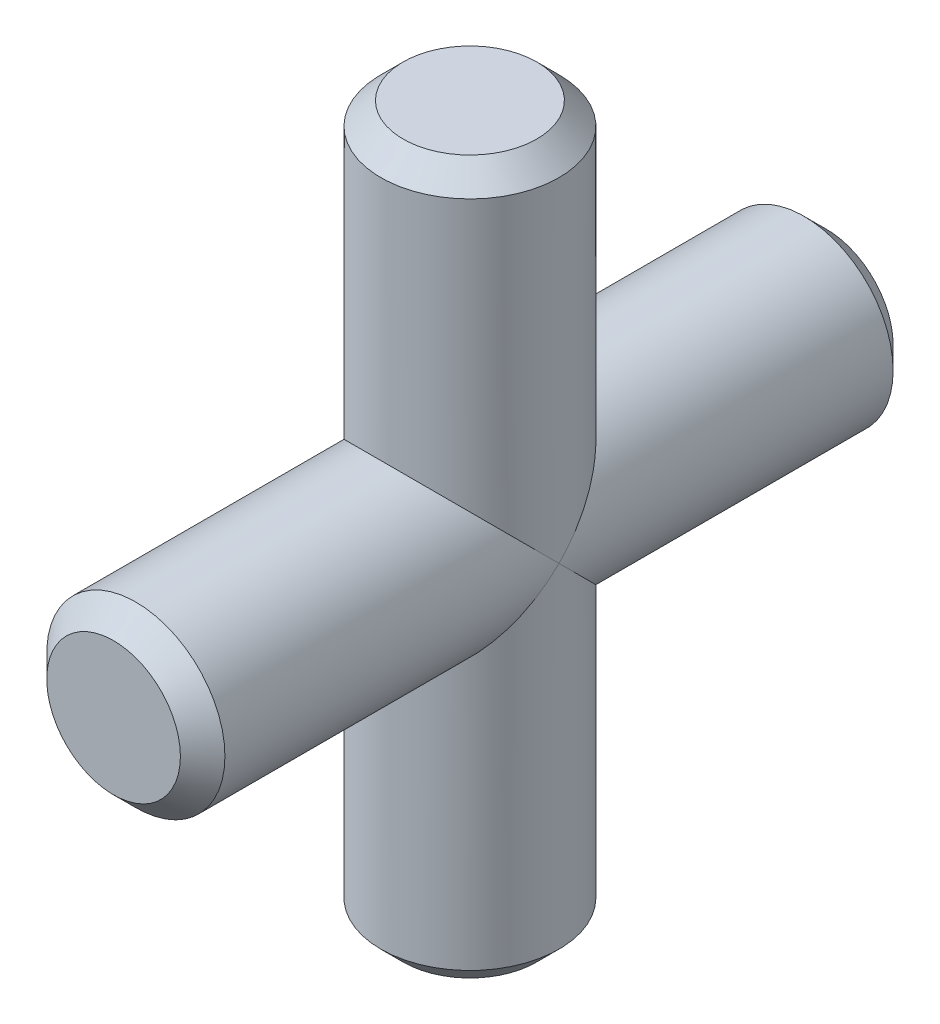
ISO-10303-21;
HEADER;
FILE_DESCRIPTION(('STEP AP214'),'2;1');
FILE_NAME('part.step','',(''),(''),'','','');
FILE_SCHEMA(('AUTOMOTIVE_DESIGN { 1 0 10303 214 1 1 1 1 }'));
ENDSEC;
DATA;
#1=APPLICATION_CONTEXT('core data for automotive mechanical design processes');
#2=APPLICATION_PROTOCOL_DEFINITION('international standard','automotive_design',2000,#1);
#3=PRODUCT_CONTEXT('',#1,'mechanical');
#4=PRODUCT('Part','Part','',(#3));
#5=PRODUCT_RELATED_PRODUCT_CATEGORY('part','',(#4));
#6=PRODUCT_DEFINITION_FORMATION('','',#4);
#7=PRODUCT_DEFINITION_CONTEXT('part definition',#1,'design');
#8=PRODUCT_DEFINITION('design','',#6,#7);
#9=PRODUCT_DEFINITION_SHAPE('','',#8);
#10=(LENGTH_UNIT() NAMED_UNIT(*) SI_UNIT(.MILLI.,.METRE.));
#11=(NAMED_UNIT(*) PLANE_ANGLE_UNIT() SI_UNIT($,.RADIAN.));
#12=(NAMED_UNIT(*) SI_UNIT($,.STERADIAN.) SOLID_ANGLE_UNIT());
#13=UNCERTAINTY_MEASURE_WITH_UNIT(LENGTH_MEASURE(1.E-05),#10,'distance_accuracy_value','');
#14=(GEOMETRIC_REPRESENTATION_CONTEXT(3) GLOBAL_UNCERTAINTY_ASSIGNED_CONTEXT((#13)) GLOBAL_UNIT_ASSIGNED_CONTEXT((#10,
#11,#12)) REPRESENTATION_CONTEXT('',''));
#15=CARTESIAN_POINT('',(0.,0.,0.));
#16=DIRECTION('',(0.,0.,1.));
#17=DIRECTION('',(1.,0.,0.));
#18=AXIS2_PLACEMENT_3D('',#15,#16,#17);
#19=CARTESIAN_POINT('',(0.,5.499989,0.));
#20=DIRECTION('',(0.,-1.,0.));
#21=DIRECTION('',(0.,0.,-1.));
#22=AXIS2_PLACEMENT_3D('',#19,#20,#21);
#23=CYLINDRICAL_SURFACE('',#22,1.37499725);
#24=CARTESIAN_POINT('',(0.,5.1562396875,0.));
#25=DIRECTION('',(0.,1.,0.));
#26=DIRECTION('',(0.,0.,1.));
#27=AXIS2_PLACEMENT_3D('',#24,#25,#26);
#28=CIRCLE('',#27,1.37499725);
#29=CARTESIAN_POINT('',(0.,5.1562396875,-1.37499725));
#30=VERTEX_POINT('',#29);
#31=EDGE_CURVE('E11',#30,#30,#28,.F.);
#32=ORIENTED_EDGE('',*,*,#31,.T.);
#33=EDGE_LOOP('',(#32));
#34=FACE_BOUND('',#33,.T.);
#35=CARTESIAN_POINT('',(0.,0.,0.));
#36=DIRECTION('',(0.,-0.707106781186547,-0.707106781186547));
#37=DIRECTION('',(0.,-0.707106781186547,0.707106781186547));
#38=AXIS2_PLACEMENT_3D('',#35,#36,#37);
#39=ELLIPSE('',#38,1.9445397591757,1.37499725);
#40=CARTESIAN_POINT('',(-1.37499725,0.,0.));
#41=VERTEX_POINT('',#40);
#42=CARTESIAN_POINT('',(1.37499725,0.,0.));
#43=VERTEX_POINT('',#42);
#44=EDGE_CURVE('E64',#41,#43,#39,.T.);
#45=ORIENTED_EDGE('',*,*,#44,.F.);
#46=CARTESIAN_POINT('',(0.,0.,0.));
#47=DIRECTION('',(0.,-0.707106781186547,0.707106781186547));
#48=DIRECTION('',(0.,-0.707106781186547,-0.707106781186547));
#49=AXIS2_PLACEMENT_3D('',#46,#47,#48);
#50=ELLIPSE('',#49,1.9445397591757,1.37499725);
#51=EDGE_CURVE('E63',#43,#41,#50,.T.);
#52=ORIENTED_EDGE('',*,*,#51,.F.);
#53=EDGE_LOOP('',(#45,#52));
#54=FACE_BOUND('',#53,.T.);
#55=ADVANCED_FACE('F43',(#34,#54),#23,.T.);
#56=CARTESIAN_POINT('',(0.,5.499989,0.));
#57=DIRECTION('',(0.,1.,0.));
#58=DIRECTION('',(0.,0.,1.));
#59=AXIS2_PLACEMENT_3D('',#56,#57,#58);
#60=PLANE('',#59);
#61=CARTESIAN_POINT('',(0.,5.499989,0.));
#62=DIRECTION('',(0.,1.,0.));
#63=DIRECTION('',(0.,0.,1.));
#64=AXIS2_PLACEMENT_3D('',#61,#62,#63);
#65=CIRCLE('',#64,1.0312479375);
#66=CARTESIAN_POINT('',(0.,5.499989,-1.0312479375));
#67=VERTEX_POINT('',#66);
#68=EDGE_CURVE('E51',#67,#67,#65,.T.);
#69=ORIENTED_EDGE('',*,*,#68,.T.);
#70=EDGE_LOOP('',(#69));
#71=FACE_BOUND('',#70,.T.);
#72=ADVANCED_FACE('F97',(#71),#60,.T.);
#73=CARTESIAN_POINT('',(0.,0.,-5.499989));
#74=DIRECTION('',(0.,0.,1.));
#75=DIRECTION('',(1.,0.,0.));
#76=AXIS2_PLACEMENT_3D('',#73,#74,#75);
#77=PLANE('',#76);
#78=CARTESIAN_POINT('',(0.,0.,-5.499989));
#79=DIRECTION('',(0.,0.,1.));
#80=DIRECTION('',(1.,0.,0.));
#81=AXIS2_PLACEMENT_3D('',#78,#79,#80);
#82=CIRCLE('',#81,1.03124793749999);
#83=CARTESIAN_POINT('',(1.03124793750001,0.,-5.499989));
#84=VERTEX_POINT('',#83);
#85=EDGE_CURVE('E78',#84,#84,#82,.F.);
#86=ORIENTED_EDGE('',*,*,#85,.T.);
#87=EDGE_LOOP('',(#86));
#88=FACE_BOUND('',#87,.T.);
#89=ADVANCED_FACE('F116',(#88),#77,.F.);
#90=CARTESIAN_POINT('',(0.,0.,5.499989));
#91=DIRECTION('',(0.,0.,-1.));
#92=DIRECTION('',(-1.,0.,0.));
#93=AXIS2_PLACEMENT_3D('',#90,#91,#92);
#94=CYLINDRICAL_SURFACE('',#93,1.37499724999999);
#95=CARTESIAN_POINT('',(0.,0.,-5.1562396875));
#96=DIRECTION('',(0.,0.,1.));
#97=DIRECTION('',(1.,0.,0.));
#98=AXIS2_PLACEMENT_3D('',#95,#96,#97);
#99=CIRCLE('',#98,1.37499724999999);
#100=CARTESIAN_POINT('',(1.37499725000002,0.,-5.1562396875));
#101=VERTEX_POINT('',#100);
#102=EDGE_CURVE('E75',#101,#101,#99,.T.);
#103=ORIENTED_EDGE('',*,*,#102,.T.);
#104=EDGE_LOOP('',(#103));
#105=FACE_BOUND('',#104,.T.);
#106=CARTESIAN_POINT('',(0.,0.,0.));
#107=DIRECTION('',(0.,-0.707106781186547,0.707106781186547));
#108=DIRECTION('',(0.,-0.707106781186547,-0.707106781186547));
#109=AXIS2_PLACEMENT_3D('',#106,#107,#108);
#110=ELLIPSE('',#109,1.9445397591757,1.37499725);
#111=EDGE_CURVE('E57',#43,#41,#110,.F.);
#112=ORIENTED_EDGE('',*,*,#111,.T.);
#113=ORIENTED_EDGE('',*,*,#44,.T.);
#114=EDGE_LOOP('',(#112,#113));
#115=FACE_BOUND('',#114,.T.);
#116=ADVANCED_FACE('F72',(#105,#115),#94,.T.);
#117=CARTESIAN_POINT('',(0.,-5.499989,0.));
#118=DIRECTION('',(0.,1.,0.));
#119=DIRECTION('',(0.,0.,1.));
#120=AXIS2_PLACEMENT_3D('',#117,#118,#119);
#121=PLANE('',#120);
#122=CARTESIAN_POINT('',(0.,-5.499989,0.));
#123=DIRECTION('',(0.,1.,0.));
#124=DIRECTION('',(0.,0.,1.));
#125=AXIS2_PLACEMENT_3D('',#122,#123,#124);
#126=CIRCLE('',#125,1.0312479375);
#127=CARTESIAN_POINT('',(0.,-5.499989,1.0312479375));
#128=VERTEX_POINT('',#127);
#129=EDGE_CURVE('E92',#128,#128,#126,.F.);
#130=ORIENTED_EDGE('',*,*,#129,.T.);
#131=EDGE_LOOP('',(#130));
#132=FACE_BOUND('',#131,.T.);
#133=ADVANCED_FACE('F121',(#132),#121,.F.);
#134=CARTESIAN_POINT('',(0.,-5.1562396875,0.));
#135=DIRECTION('',(0.,1.,0.));
#136=DIRECTION('',(0.,0.,1.));
#137=AXIS2_PLACEMENT_3D('',#134,#135,#136);
#138=CIRCLE('',#137,1.37499725);
#139=CARTESIAN_POINT('',(0.,-5.1562396875,1.37499725));
#140=VERTEX_POINT('',#139);
#141=EDGE_CURVE('E89',#140,#140,#138,.T.);
#142=ORIENTED_EDGE('',*,*,#141,.T.);
#143=EDGE_LOOP('',(#142));
#144=FACE_BOUND('',#143,.T.);
#145=CARTESIAN_POINT('',(0.,0.,0.));
#146=DIRECTION('',(0.,-0.707106781186547,-0.707106781186547));
#147=DIRECTION('',(0.,-0.707106781186547,0.707106781186547));
#148=AXIS2_PLACEMENT_3D('',#145,#146,#147);
#149=ELLIPSE('',#148,1.9445397591757,1.37499725);
#150=EDGE_CURVE('E70',#41,#43,#149,.F.);
#151=ORIENTED_EDGE('',*,*,#150,.F.);
#152=ORIENTED_EDGE('',*,*,#111,.F.);
#153=EDGE_LOOP('',(#151,#152));
#154=FACE_BOUND('',#153,.T.);
#155=ADVANCED_FACE('F69',(#144,#154),#23,.T.);
#156=CARTESIAN_POINT('',(0.,0.,5.1562396875));
#157=DIRECTION('',(0.,0.,1.));
#158=DIRECTION('',(1.,0.,0.));
#159=AXIS2_PLACEMENT_3D('',#156,#157,#158);
#160=CIRCLE('',#159,1.37499724999999);
#161=CARTESIAN_POINT('',(1.37499725000002,0.,5.1562396875));
#162=VERTEX_POINT('',#161);
#163=EDGE_CURVE('E86',#162,#162,#160,.F.);
#164=ORIENTED_EDGE('',*,*,#163,.T.);
#165=EDGE_LOOP('',(#164));
#166=FACE_BOUND('',#165,.T.);
#167=ORIENTED_EDGE('',*,*,#51,.T.);
#168=ORIENTED_EDGE('',*,*,#150,.T.);
#169=EDGE_LOOP('',(#167,#168));
#170=FACE_BOUND('',#169,.T.);
#171=ADVANCED_FACE('F74',(#166,#170),#94,.T.);
#172=CARTESIAN_POINT('',(0.,0.,5.499989));
#173=DIRECTION('',(0.,0.,1.));
#174=DIRECTION('',(1.,0.,0.));
#175=AXIS2_PLACEMENT_3D('',#172,#173,#174);
#176=PLANE('',#175);
#177=CARTESIAN_POINT('',(0.,0.,5.499989));
#178=DIRECTION('',(0.,0.,1.));
#179=DIRECTION('',(1.,0.,0.));
#180=AXIS2_PLACEMENT_3D('',#177,#178,#179);
#181=CIRCLE('',#180,1.03124793749999);
#182=CARTESIAN_POINT('',(1.03124793750002,0.,5.499989));
#183=VERTEX_POINT('',#182);
#184=EDGE_CURVE('E83',#183,#183,#181,.T.);
#185=ORIENTED_EDGE('',*,*,#184,.T.);
#186=EDGE_LOOP('',(#185));
#187=FACE_BOUND('',#186,.T.);
#188=ADVANCED_FACE('F128',(#187),#176,.T.);
#189=CARTESIAN_POINT('',(0.,0.,-5.1562396875));
#190=DIRECTION('',(0.,0.,1.));
#191=DIRECTION('',(1.,0.,0.));
#192=AXIS2_PLACEMENT_3D('',#189,#190,#191);
#193=CONICAL_SURFACE('',#192,1.37499724999999,0.785398163397453);
#194=ORIENTED_EDGE('',*,*,#85,.F.);
#195=EDGE_LOOP('',(#194));
#196=FACE_BOUND('',#195,.T.);
#197=ORIENTED_EDGE('',*,*,#102,.F.);
#198=EDGE_LOOP('',(#197));
#199=FACE_BOUND('',#198,.T.);
#200=ADVANCED_FACE('F144',(#196,#199),#193,.T.);
#201=CARTESIAN_POINT('',(0.,0.,5.499989));
#202=DIRECTION('',(0.,0.,-1.));
#203=DIRECTION('',(-1.,0.,0.));
#204=AXIS2_PLACEMENT_3D('',#201,#202,#203);
#205=CONICAL_SURFACE('',#204,1.03124793749999,0.785398163397449);
#206=ORIENTED_EDGE('',*,*,#163,.F.);
#207=EDGE_LOOP('',(#206));
#208=FACE_BOUND('',#207,.T.);
#209=ORIENTED_EDGE('',*,*,#184,.F.);
#210=EDGE_LOOP('',(#209));
#211=FACE_BOUND('',#210,.T.);
#212=ADVANCED_FACE('F106',(#208,#211),#205,.T.);
#213=CARTESIAN_POINT('',(0.,-5.1562396875,0.));
#214=DIRECTION('',(0.,1.,0.));
#215=DIRECTION('',(0.,0.,1.));
#216=AXIS2_PLACEMENT_3D('',#213,#214,#215);
#217=CONICAL_SURFACE('',#216,1.37499725,0.785398163397453);
#218=ORIENTED_EDGE('',*,*,#129,.F.);
#219=EDGE_LOOP('',(#218));
#220=FACE_BOUND('',#219,.T.);
#221=ORIENTED_EDGE('',*,*,#141,.F.);
#222=EDGE_LOOP('',(#221));
#223=FACE_BOUND('',#222,.T.);
#224=ADVANCED_FACE('F100',(#220,#223),#217,.T.);
#225=CARTESIAN_POINT('',(0.,5.499989,0.));
#226=DIRECTION('',(0.,-1.,0.));
#227=DIRECTION('',(0.,0.,-1.));
#228=AXIS2_PLACEMENT_3D('',#225,#226,#227);
#229=CONICAL_SURFACE('',#228,1.0312479375,0.785398163397446);
#230=CARTESIAN_POINT('',(0.,5.1562396875,-1.37499725));
#231=CARTESIAN_POINT('',(0.,5.15982040950521,-1.37141652799479));
#232=CARTESIAN_POINT('',(0.,5.16340113151042,-1.36783580598958));
#233=CARTESIAN_POINT('',(0.,5.17056257552083,-1.36067436197917));
#234=CARTESIAN_POINT('',(0.,5.17414329752604,-1.35709363997396));
#235=CARTESIAN_POINT('',(0.,5.18130474153646,-1.34993219596354));
#236=CARTESIAN_POINT('',(0.,5.18488546354166,-1.34635147395833));
#237=CARTESIAN_POINT('',(0.,5.19204690755208,-1.33919002994792));
#238=CARTESIAN_POINT('',(0.,5.19562762955729,-1.33560930794271));
#239=CARTESIAN_POINT('',(0.,5.20278907356771,-1.32844786393229));
#240=CARTESIAN_POINT('',(0.,5.20636979557291,-1.32486714192708));
#241=CARTESIAN_POINT('',(0.,5.21353123958333,-1.31770569791667));
#242=CARTESIAN_POINT('',(0.,5.21711196158854,-1.31412497591146));
#243=CARTESIAN_POINT('',(0.,5.22427340559896,-1.30696353190104));
#244=CARTESIAN_POINT('',(0.,5.22785412760416,-1.30338280989583));
#245=CARTESIAN_POINT('',(0.,5.23501557161458,-1.29622136588542));
#246=CARTESIAN_POINT('',(0.,5.23859629361979,-1.29264064388021));
#247=CARTESIAN_POINT('',(0.,5.24575773763021,-1.28547919986979));
#248=CARTESIAN_POINT('',(0.,5.24933845963541,-1.28189847786458));
#249=CARTESIAN_POINT('',(0.,5.25649990364583,-1.27473703385417));
#250=CARTESIAN_POINT('',(0.,5.26008062565104,-1.27115631184896));
#251=CARTESIAN_POINT('',(0.,5.26724206966146,-1.26399486783854));
#252=CARTESIAN_POINT('',(0.,5.27082279166667,-1.26041414583333));
#253=CARTESIAN_POINT('',(0.,5.27798423567708,-1.25325270182292));
#254=CARTESIAN_POINT('',(0.,5.28156495768229,-1.24967197981771));
#255=CARTESIAN_POINT('',(0.,5.28872640169271,-1.24251053580729));
#256=CARTESIAN_POINT('',(0.,5.29230712369792,-1.23892981380208));
#257=CARTESIAN_POINT('',(0.,5.29946856770833,-1.23176836979167));
#258=CARTESIAN_POINT('',(0.,5.30304928971354,-1.22818764778646));
#259=CARTESIAN_POINT('',(0.,5.31021073372396,-1.22102620377604));
#260=CARTESIAN_POINT('',(0.,5.31379145572917,-1.21744548177083));
#261=CARTESIAN_POINT('',(0.,5.32095289973958,-1.21028403776042));
#262=CARTESIAN_POINT('',(0.,5.32453362174479,-1.20670331575521));
#263=CARTESIAN_POINT('',(0.,5.33169506575521,-1.19954187174479));
#264=CARTESIAN_POINT('',(0.,5.33527578776042,-1.19596114973958));
#265=CARTESIAN_POINT('',(0.,5.34243723177083,-1.18879970572917));
#266=CARTESIAN_POINT('',(0.,5.34601795377604,-1.18521898372396));
#267=CARTESIAN_POINT('',(0.,5.35317939778646,-1.17805753971354));
#268=CARTESIAN_POINT('',(0.,5.35676011979167,-1.17447681770833));
#269=CARTESIAN_POINT('',(0.,5.36392156380208,-1.16731537369792));
#270=CARTESIAN_POINT('',(0.,5.36750228580729,-1.16373465169271));
#271=CARTESIAN_POINT('',(0.,5.37466372981771,-1.15657320768229));
#272=CARTESIAN_POINT('',(0.,5.37824445182292,-1.15299248567708));
#273=CARTESIAN_POINT('',(0.,5.38540589583333,-1.14583104166667));
#274=CARTESIAN_POINT('',(0.,5.38898661783854,-1.14225031966146));
#275=CARTESIAN_POINT('',(0.,5.39614806184896,-1.13508887565104));
#276=CARTESIAN_POINT('',(0.,5.39972878385417,-1.13150815364583));
#277=CARTESIAN_POINT('',(0.,5.40689022786458,-1.12434670963542));
#278=CARTESIAN_POINT('',(0.,5.41047094986979,-1.12076598763021));
#279=CARTESIAN_POINT('',(0.,5.41763239388021,-1.11360454361979));
#280=CARTESIAN_POINT('',(0.,5.42121311588542,-1.11002382161458));
#281=CARTESIAN_POINT('',(0.,5.42837455989583,-1.10286237760417));
#282=CARTESIAN_POINT('',(0.,5.43195528190104,-1.09928165559896));
#283=CARTESIAN_POINT('',(0.,5.43911672591146,-1.09212021158854));
#284=CARTESIAN_POINT('',(0.,5.44269744791667,-1.08853948958333));
#285=CARTESIAN_POINT('',(0.,5.44985889192708,-1.08137804557292));
#286=CARTESIAN_POINT('',(0.,5.45343961393229,-1.07779732356771));
#287=CARTESIAN_POINT('',(0.,5.46060105794271,-1.07063587955729));
#288=CARTESIAN_POINT('',(0.,5.46418177994792,-1.06705515755208));
#289=CARTESIAN_POINT('',(0.,5.47134322395833,-1.05989371354167));
#290=CARTESIAN_POINT('',(0.,5.47492394596354,-1.05631299153646));
#291=CARTESIAN_POINT('',(0.,5.48208538997396,-1.04915154752604));
#292=CARTESIAN_POINT('',(0.,5.48566611197917,-1.04557082552083));
#293=CARTESIAN_POINT('',(0.,5.49282755598958,-1.03840938151042));
#294=CARTESIAN_POINT('',(0.,5.49640827799479,-1.03482865950521));
#295=CARTESIAN_POINT('',(0.,5.499989,-1.0312479375));
#296=B_SPLINE_CURVE_WITH_KNOTS('',3,(#230,#231,#232,#233,#234,#235,#236,#237,#238,#239,#240,
#241,#242,#243,#244,#245,#246,#247,#248,#249,#250,#251,#252,#253,#254,#255,#256,#257,#258,#259,
#260,#261,#262,#263,#264,#265,#266,#267,#268,#269,#270,#271,#272,#273,#274,#275,#276,#277,#278,
#279,#280,#281,#282,#283,#284,#285,#286,#287,#288,#289,#290,#291,#292,#293,#294,#295),
.UNSPECIFIED.,.F.,.F.,(4,2,2,2,2,2,2,2,2,2,2,2,2,2,2,2,2,2,2,2,2,2,2,2,2,2,2,2,2,2,2,2,4),(0.,
0.0151917168685603,0.0303834337371199,0.0455751506056802,0.0607668674742406,0.0759585843428007,
0.0911503012113611,0.106342018079921,0.121533734948482,0.136725451817042,0.151917168685602,
0.167108885554162,0.182300602422723,0.197492319291283,0.212684036159843,0.227875753028404,
0.243067469896964,0.258259186765524,0.273450903634085,0.288642620502645,0.303834337371205,
0.319026054239765,0.334217771108326,0.349409487976886,0.364601204845446,0.379792921714007,
0.394984638582567,0.410176355451127,0.425368072319687,0.440559789188248,0.455751506056808,
0.470943222925368,0.486134939793929),.UNSPECIFIED.);
#297=EDGE_CURVE('BSEAM45',#30,#67,#296,.T.);
#298=ORIENTED_EDGE('',*,*,#31,.F.);
#299=ORIENTED_EDGE('',*,*,#68,.F.);
#300=ORIENTED_EDGE('',*,*,#297,.T.);
#301=ORIENTED_EDGE('',*,*,#297,.F.);
#302=EDGE_LOOP('',(#298,#300,#299,#301));
#303=FACE_BOUND('',#302,.T.);
#304=ADVANCED_FACE('F45',(#303),#229,.T.);
#305=CLOSED_SHELL('',(#55,#72,#89,#116,#133,#155,#171,#188,#200,#212,#224,#304));
#306=MANIFOLD_SOLID_BREP('B2',#305);
#307=ADVANCED_BREP_SHAPE_REPRESENTATION('',(#18,#306),#14);
#308=SHAPE_DEFINITION_REPRESENTATION(#9,#307);
ENDSEC;
END-ISO-10303-21;
